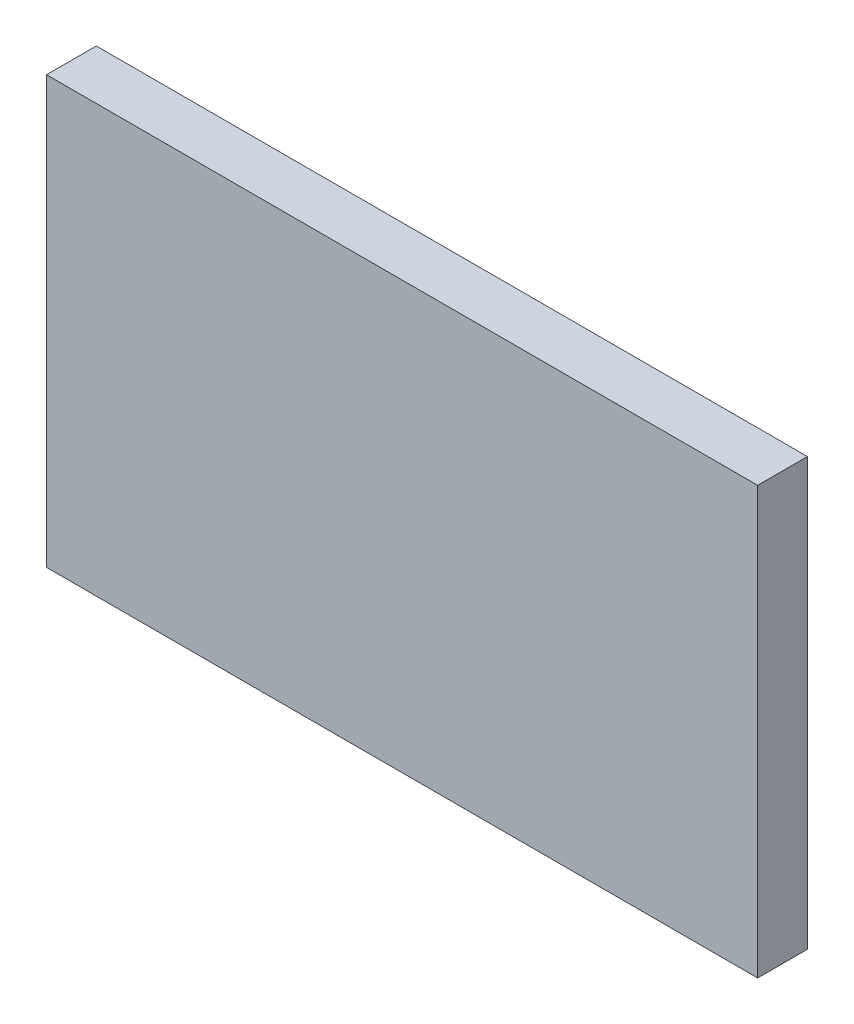
ISO-10303-21;
HEADER;
FILE_DESCRIPTION(('STEP AP214'),'2;1');
FILE_NAME('part.step','',(''),(''),'','','');
FILE_SCHEMA(('AUTOMOTIVE_DESIGN { 1 0 10303 214 1 1 1 1 }'));
ENDSEC;
DATA;
#1=APPLICATION_CONTEXT('core data for automotive mechanical design processes');
#2=APPLICATION_PROTOCOL_DEFINITION('international standard','automotive_design',2000,#1);
#3=PRODUCT_CONTEXT('',#1,'mechanical');
#4=PRODUCT('Part','Part','',(#3));
#5=PRODUCT_RELATED_PRODUCT_CATEGORY('part','',(#4));
#6=PRODUCT_DEFINITION_FORMATION('','',#4);
#7=PRODUCT_DEFINITION_CONTEXT('part definition',#1,'design');
#8=PRODUCT_DEFINITION('design','',#6,#7);
#9=PRODUCT_DEFINITION_SHAPE('','',#8);
#10=(LENGTH_UNIT() NAMED_UNIT(*) SI_UNIT(.MILLI.,.METRE.));
#11=(NAMED_UNIT(*) PLANE_ANGLE_UNIT() SI_UNIT($,.RADIAN.));
#12=(NAMED_UNIT(*) SI_UNIT($,.STERADIAN.) SOLID_ANGLE_UNIT());
#13=UNCERTAINTY_MEASURE_WITH_UNIT(LENGTH_MEASURE(1.E-05),#10,'distance_accuracy_value','');
#14=(GEOMETRIC_REPRESENTATION_CONTEXT(3) GLOBAL_UNCERTAINTY_ASSIGNED_CONTEXT((#13)) GLOBAL_UNIT_ASSIGNED_CONTEXT((#10,
#11,#12)) REPRESENTATION_CONTEXT('',''));
#15=CARTESIAN_POINT('',(0.,0.,0.));
#16=DIRECTION('',(0.,0.,1.));
#17=DIRECTION('',(1.,0.,0.));
#18=AXIS2_PLACEMENT_3D('',#15,#16,#17);
#19=CARTESIAN_POINT('',(50.,-30.,10.));
#20=DIRECTION('',(-1.,0.,0.));
#21=DIRECTION('',(0.,0.,1.));
#22=AXIS2_PLACEMENT_3D('',#19,#20,#21);
#23=PLANE('',#22);
#24=DIRECTION('',(0.,1.,0.));
#25=VECTOR('',#24,1.);
#26=CARTESIAN_POINT('',(50.,-30.,3.));
#27=LINE('',#26,#25);
#28=CARTESIAN_POINT('',(50.,-30.,3.));
#29=VERTEX_POINT('',#28);
#30=CARTESIAN_POINT('',(50.,30.,3.));
#31=VERTEX_POINT('',#30);
#32=EDGE_CURVE('E57',#29,#31,#27,.T.);
#33=ORIENTED_EDGE('',*,*,#32,.T.);
#34=DIRECTION('',(0.,0.,-1.));
#35=VECTOR('',#34,1.);
#36=CARTESIAN_POINT('',(50.,30.,10.));
#37=LINE('',#36,#35);
#38=CARTESIAN_POINT('',(50.,30.,10.));
#39=VERTEX_POINT('',#38);
#40=EDGE_CURVE('E11',#39,#31,#37,.T.);
#41=ORIENTED_EDGE('',*,*,#40,.F.);
#42=DIRECTION('',(0.,1.,0.));
#43=VECTOR('',#42,1.);
#44=CARTESIAN_POINT('',(50.,-30.,10.));
#45=LINE('',#44,#43);
#46=CARTESIAN_POINT('',(50.,-30.,10.));
#47=VERTEX_POINT('',#46);
#48=EDGE_CURVE('E100',#47,#39,#45,.T.);
#49=ORIENTED_EDGE('',*,*,#48,.F.);
#50=DIRECTION('',(0.,0.,-1.));
#51=VECTOR('',#50,1.);
#52=CARTESIAN_POINT('',(50.,-30.,10.));
#53=LINE('',#52,#51);
#54=EDGE_CURVE('E94',#47,#29,#53,.T.);
#55=ORIENTED_EDGE('',*,*,#54,.T.);
#56=EDGE_LOOP('',(#33,#41,#49,#55));
#57=FACE_BOUND('',#56,.T.);
#58=ADVANCED_FACE('F43',(#57),#23,.F.);
#59=CARTESIAN_POINT('',(-50.,30.,10.));
#60=DIRECTION('',(0.,-1.,0.));
#61=DIRECTION('',(1.,0.,0.));
#62=AXIS2_PLACEMENT_3D('',#59,#60,#61);
#63=PLANE('',#62);
#64=DIRECTION('',(-1.,0.,0.));
#65=VECTOR('',#64,1.);
#66=CARTESIAN_POINT('',(-50.,30.,3.));
#67=LINE('',#66,#65);
#68=CARTESIAN_POINT('',(-50.,30.,3.));
#69=VERTEX_POINT('',#68);
#70=EDGE_CURVE('E82',#31,#69,#67,.T.);
#71=ORIENTED_EDGE('',*,*,#70,.T.);
#72=DIRECTION('',(0.,0.,-1.));
#73=VECTOR('',#72,1.);
#74=CARTESIAN_POINT('',(-50.,30.,10.));
#75=LINE('',#74,#73);
#76=CARTESIAN_POINT('',(-50.,30.,10.));
#77=VERTEX_POINT('',#76);
#78=EDGE_CURVE('E50',#77,#69,#75,.T.);
#79=ORIENTED_EDGE('',*,*,#78,.F.);
#80=DIRECTION('',(-1.,0.,0.));
#81=VECTOR('',#80,1.);
#82=CARTESIAN_POINT('',(-50.,30.,10.));
#83=LINE('',#82,#81);
#84=EDGE_CURVE('E97',#39,#77,#83,.T.);
#85=ORIENTED_EDGE('',*,*,#84,.F.);
#86=ORIENTED_EDGE('',*,*,#40,.T.);
#87=EDGE_LOOP('',(#71,#79,#85,#86));
#88=FACE_BOUND('',#87,.T.);
#89=ADVANCED_FACE('F96',(#88),#63,.F.);
#90=CARTESIAN_POINT('',(-50.,-30.,10.));
#91=DIRECTION('',(1.,0.,0.));
#92=DIRECTION('',(0.,0.,-1.));
#93=AXIS2_PLACEMENT_3D('',#90,#91,#92);
#94=PLANE('',#93);
#95=DIRECTION('',(0.,-1.,0.));
#96=VECTOR('',#95,1.);
#97=CARTESIAN_POINT('',(-50.,-30.,3.));
#98=LINE('',#97,#96);
#99=CARTESIAN_POINT('',(-50.,-30.,3.));
#100=VERTEX_POINT('',#99);
#101=EDGE_CURVE('E85',#69,#100,#98,.T.);
#102=ORIENTED_EDGE('',*,*,#101,.T.);
#103=DIRECTION('',(0.,0.,-1.));
#104=VECTOR('',#103,1.);
#105=CARTESIAN_POINT('',(-50.,-30.,10.));
#106=LINE('',#105,#104);
#107=CARTESIAN_POINT('',(-50.,-30.,10.));
#108=VERTEX_POINT('',#107);
#109=EDGE_CURVE('E111',#108,#100,#106,.T.);
#110=ORIENTED_EDGE('',*,*,#109,.F.);
#111=DIRECTION('',(0.,-1.,0.));
#112=VECTOR('',#111,1.);
#113=CARTESIAN_POINT('',(-50.,-30.,10.));
#114=LINE('',#113,#112);
#115=EDGE_CURVE('E99',#77,#108,#114,.T.);
#116=ORIENTED_EDGE('',*,*,#115,.F.);
#117=ORIENTED_EDGE('',*,*,#78,.T.);
#118=EDGE_LOOP('',(#102,#110,#116,#117));
#119=FACE_BOUND('',#118,.T.);
#120=ADVANCED_FACE('F114',(#119),#94,.F.);
#121=CARTESIAN_POINT('',(-50.,-30.,10.));
#122=DIRECTION('',(0.,1.,0.));
#123=DIRECTION('',(0.,0.,1.));
#124=AXIS2_PLACEMENT_3D('',#121,#122,#123);
#125=PLANE('',#124);
#126=DIRECTION('',(1.,0.,0.));
#127=VECTOR('',#126,1.);
#128=CARTESIAN_POINT('',(-50.,-30.,3.));
#129=LINE('',#128,#127);
#130=EDGE_CURVE('E103',#100,#29,#129,.T.);
#131=ORIENTED_EDGE('',*,*,#130,.T.);
#132=ORIENTED_EDGE('',*,*,#54,.F.);
#133=DIRECTION('',(1.,0.,0.));
#134=VECTOR('',#133,1.);
#135=CARTESIAN_POINT('',(-50.,-30.,10.));
#136=LINE('',#135,#134);
#137=EDGE_CURVE('E65',#108,#47,#136,.T.);
#138=ORIENTED_EDGE('',*,*,#137,.F.);
#139=ORIENTED_EDGE('',*,*,#109,.T.);
#140=EDGE_LOOP('',(#131,#132,#138,#139));
#141=FACE_BOUND('',#140,.T.);
#142=ADVANCED_FACE('F117',(#141),#125,.F.);
#143=CARTESIAN_POINT('',(0.,0.,10.));
#144=DIRECTION('',(0.,0.,-1.));
#145=DIRECTION('',(-1.,0.,0.));
#146=AXIS2_PLACEMENT_3D('',#143,#144,#145);
#147=PLANE('',#146);
#148=ORIENTED_EDGE('',*,*,#48,.T.);
#149=ORIENTED_EDGE('',*,*,#84,.T.);
#150=ORIENTED_EDGE('',*,*,#115,.T.);
#151=ORIENTED_EDGE('',*,*,#137,.T.);
#152=EDGE_LOOP('',(#148,#149,#150,#151));
#153=FACE_BOUND('',#152,.T.);
#154=ADVANCED_FACE('F102',(#153),#147,.F.);
#155=CARTESIAN_POINT('',(0.,0.,3.));
#156=DIRECTION('',(0.,0.,-1.));
#157=DIRECTION('',(-1.,0.,0.));
#158=AXIS2_PLACEMENT_3D('',#155,#156,#157);
#159=PLANE('',#158);
#160=ORIENTED_EDGE('',*,*,#32,.F.);
#161=ORIENTED_EDGE('',*,*,#130,.F.);
#162=ORIENTED_EDGE('',*,*,#101,.F.);
#163=ORIENTED_EDGE('',*,*,#70,.F.);
#164=EDGE_LOOP('',(#160,#161,#162,#163));
#165=FACE_BOUND('',#164,.T.);
#166=ADVANCED_FACE('F83',(#165),#159,.T.);
#167=CLOSED_SHELL('',(#58,#89,#120,#142,#154,#166));
#168=MANIFOLD_SOLID_BREP('B2',#167);
#169=ADVANCED_BREP_SHAPE_REPRESENTATION('',(#18,#168),#14);
#170=SHAPE_DEFINITION_REPRESENTATION(#9,#169);
ENDSEC;
END-ISO-10303-21;
